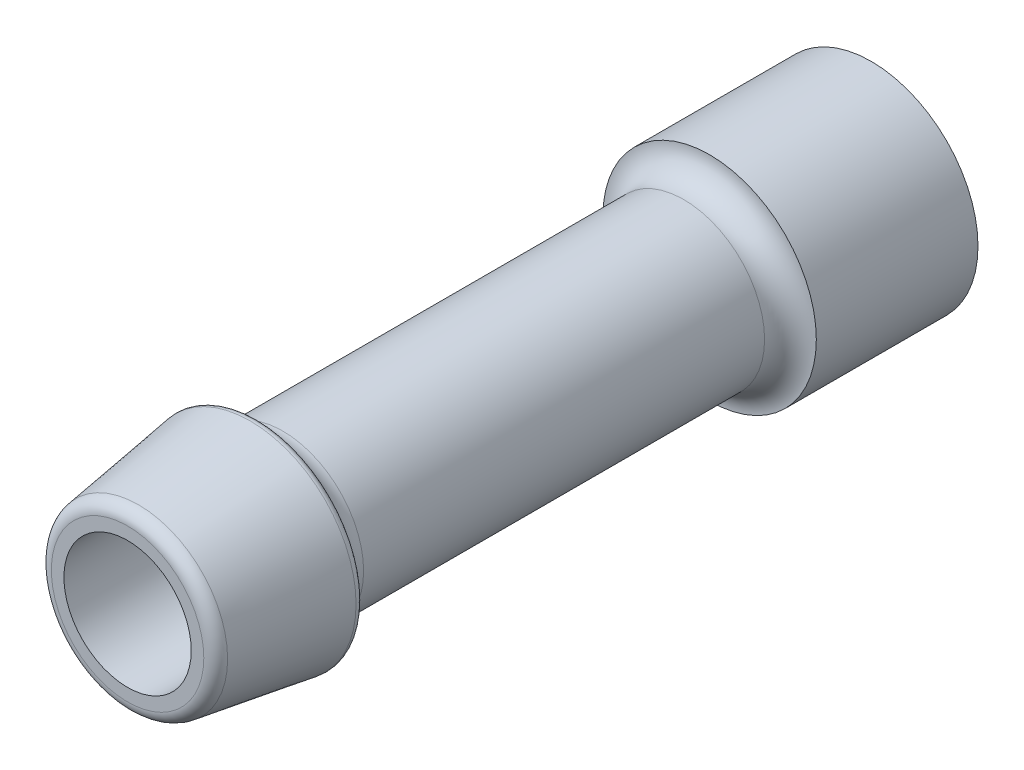
ISO-10303-21;
HEADER;
FILE_DESCRIPTION(('STEP AP214'),'2;1');
FILE_NAME('part.step','',(''),(''),'','','');
FILE_SCHEMA(('AUTOMOTIVE_DESIGN { 1 0 10303 214 1 1 1 1 }'));
ENDSEC;
DATA;
#1=APPLICATION_CONTEXT('core data for automotive mechanical design processes');
#2=APPLICATION_PROTOCOL_DEFINITION('international standard','automotive_design',2000,#1);
#3=PRODUCT_CONTEXT('',#1,'mechanical');
#4=PRODUCT('Part','Part','',(#3));
#5=PRODUCT_RELATED_PRODUCT_CATEGORY('part','',(#4));
#6=PRODUCT_DEFINITION_FORMATION('','',#4);
#7=PRODUCT_DEFINITION_CONTEXT('part definition',#1,'design');
#8=PRODUCT_DEFINITION('design','',#6,#7);
#9=PRODUCT_DEFINITION_SHAPE('','',#8);
#10=(LENGTH_UNIT() NAMED_UNIT(*) SI_UNIT(.MILLI.,.METRE.));
#11=(NAMED_UNIT(*) PLANE_ANGLE_UNIT() SI_UNIT($,.RADIAN.));
#12=(NAMED_UNIT(*) SI_UNIT($,.STERADIAN.) SOLID_ANGLE_UNIT());
#13=UNCERTAINTY_MEASURE_WITH_UNIT(LENGTH_MEASURE(1.E-05),#10,'distance_accuracy_value','');
#14=(GEOMETRIC_REPRESENTATION_CONTEXT(3) GLOBAL_UNCERTAINTY_ASSIGNED_CONTEXT((#13)) GLOBAL_UNIT_ASSIGNED_CONTEXT((#10,
#11,#12)) REPRESENTATION_CONTEXT('',''));
#15=CARTESIAN_POINT('',(0.,0.,0.));
#16=DIRECTION('',(0.,0.,1.));
#17=DIRECTION('',(1.,0.,0.));
#18=AXIS2_PLACEMENT_3D('',#15,#16,#17);
#19=CARTESIAN_POINT('',(0.,0.,29.21));
#20=DIRECTION('',(0.,0.,-1.));
#21=DIRECTION('',(-1.,0.,0.));
#22=AXIS2_PLACEMENT_3D('',#19,#20,#21);
#23=CYLINDRICAL_SURFACE('',#22,4.191);
#24=CARTESIAN_POINT('',(0.,0.,0.));
#25=DIRECTION('',(0.,0.,1.));
#26=DIRECTION('',(1.,0.,0.));
#27=AXIS2_PLACEMENT_3D('',#24,#25,#26);
#28=CIRCLE('',#27,4.191);
#29=CARTESIAN_POINT('',(-4.191,0.,0.));
#30=VERTEX_POINT('',#29);
#31=EDGE_CURVE('E71',#30,#30,#28,.T.);
#32=CARTESIAN_POINT('',(0.,0.,6.35));
#33=DIRECTION('',(0.,0.,1.));
#34=DIRECTION('',(1.,0.,0.));
#35=AXIS2_PLACEMENT_3D('',#32,#33,#34);
#36=CIRCLE('',#35,4.191);
#37=CARTESIAN_POINT('',(-4.191,0.,6.34999999999999));
#38=VERTEX_POINT('',#37);
#39=EDGE_CURVE('E72',#38,#38,#36,.T.);
#40=CARTESIAN_POINT('',(-4.191,0.,0.));
#41=CARTESIAN_POINT('',(-4.191,0.,0.066145833333333));
#42=CARTESIAN_POINT('',(-4.191,0.,0.132291666666666));
#43=CARTESIAN_POINT('',(-4.191,0.,0.264583333333332));
#44=CARTESIAN_POINT('',(-4.191,0.,0.330729166666665));
#45=CARTESIAN_POINT('',(-4.191,0.,0.463020833333332));
#46=CARTESIAN_POINT('',(-4.191,0.,0.529166666666666));
#47=CARTESIAN_POINT('',(-4.191,0.,0.661458333333333));
#48=CARTESIAN_POINT('',(-4.191,0.,0.727604166666666));
#49=CARTESIAN_POINT('',(-4.191,0.,0.859895833333332));
#50=CARTESIAN_POINT('',(-4.191,0.,0.926041666666665));
#51=CARTESIAN_POINT('',(-4.191,0.,1.05833333333333));
#52=CARTESIAN_POINT('',(-4.191,0.,1.12447916666667));
#53=CARTESIAN_POINT('',(-4.191,0.,1.25677083333333));
#54=CARTESIAN_POINT('',(-4.191,0.,1.32291666666667));
#55=CARTESIAN_POINT('',(-4.191,0.,1.45520833333333));
#56=CARTESIAN_POINT('',(-4.191,0.,1.52135416666667));
#57=CARTESIAN_POINT('',(-4.191,0.,1.65364583333333));
#58=CARTESIAN_POINT('',(-4.191,0.,1.71979166666666));
#59=CARTESIAN_POINT('',(-4.191,0.,1.85208333333333));
#60=CARTESIAN_POINT('',(-4.191,0.,1.91822916666666));
#61=CARTESIAN_POINT('',(-4.191,0.,2.05052083333333));
#62=CARTESIAN_POINT('',(-4.191,0.,2.11666666666666));
#63=CARTESIAN_POINT('',(-4.191,0.,2.24895833333333));
#64=CARTESIAN_POINT('',(-4.191,0.,2.31510416666667));
#65=CARTESIAN_POINT('',(-4.191,0.,2.44739583333333));
#66=CARTESIAN_POINT('',(-4.191,0.,2.51354166666666));
#67=CARTESIAN_POINT('',(-4.191,0.,2.64583333333333));
#68=CARTESIAN_POINT('',(-4.191,0.,2.71197916666667));
#69=CARTESIAN_POINT('',(-4.191,0.,2.84427083333333));
#70=CARTESIAN_POINT('',(-4.191,0.,2.91041666666667));
#71=CARTESIAN_POINT('',(-4.191,0.,3.04270833333333));
#72=CARTESIAN_POINT('',(-4.191,0.,3.10885416666666));
#73=CARTESIAN_POINT('',(-4.191,0.,3.24114583333333));
#74=CARTESIAN_POINT('',(-4.191,0.,3.30729166666666));
#75=CARTESIAN_POINT('',(-4.191,0.,3.43958333333333));
#76=CARTESIAN_POINT('',(-4.191,0.,3.50572916666666));
#77=CARTESIAN_POINT('',(-4.191,0.,3.63802083333333));
#78=CARTESIAN_POINT('',(-4.191,0.,3.70416666666666));
#79=CARTESIAN_POINT('',(-4.191,0.,3.83645833333333));
#80=CARTESIAN_POINT('',(-4.191,0.,3.90260416666666));
#81=CARTESIAN_POINT('',(-4.191,0.,4.03489583333333));
#82=CARTESIAN_POINT('',(-4.191,0.,4.10104166666666));
#83=CARTESIAN_POINT('',(-4.191,0.,4.23333333333333));
#84=CARTESIAN_POINT('',(-4.191,0.,4.29947916666666));
#85=CARTESIAN_POINT('',(-4.191,0.,4.43177083333333));
#86=CARTESIAN_POINT('',(-4.191,0.,4.49791666666666));
#87=CARTESIAN_POINT('',(-4.191,0.,4.63020833333333));
#88=CARTESIAN_POINT('',(-4.191,0.,4.69635416666666));
#89=CARTESIAN_POINT('',(-4.191,0.,4.82864583333333));
#90=CARTESIAN_POINT('',(-4.191,0.,4.89479166666666));
#91=CARTESIAN_POINT('',(-4.191,0.,5.02708333333333));
#92=CARTESIAN_POINT('',(-4.191,0.,5.09322916666666));
#93=CARTESIAN_POINT('',(-4.191,0.,5.22552083333333));
#94=CARTESIAN_POINT('',(-4.191,0.,5.29166666666666));
#95=CARTESIAN_POINT('',(-4.191,0.,5.42395833333333));
#96=CARTESIAN_POINT('',(-4.191,0.,5.49010416666666));
#97=CARTESIAN_POINT('',(-4.191,0.,5.62239583333333));
#98=CARTESIAN_POINT('',(-4.191,0.,5.68854166666666));
#99=CARTESIAN_POINT('',(-4.191,0.,5.82083333333333));
#100=CARTESIAN_POINT('',(-4.191,0.,5.88697916666666));
#101=CARTESIAN_POINT('',(-4.191,0.,6.01927083333333));
#102=CARTESIAN_POINT('',(-4.191,0.,6.08541666666666));
#103=CARTESIAN_POINT('',(-4.191,0.,6.21770833333333));
#104=CARTESIAN_POINT('',(-4.191,0.,6.28385416666666));
#105=CARTESIAN_POINT('',(-4.191,0.,6.34999999999999));
#106=B_SPLINE_CURVE_WITH_KNOTS('',3,(#40,#41,#42,#43,#44,#45,#46,#47,#48,#49,#50,#51,#52,#53,
#54,#55,#56,#57,#58,#59,#60,#61,#62,#63,#64,#65,#66,#67,#68,#69,#70,#71,#72,#73,#74,#75,#76,#77,
#78,#79,#80,#81,#82,#83,#84,#85,#86,#87,#88,#89,#90,#91,#92,#93,#94,#95,#96,#97,#98,#99,#100,
#101,#102,#103,#104,#105),.UNSPECIFIED.,.F.,.F.,(4,2,2,2,2,2,2,2,2,2,2,2,2,2,2,2,2,2,2,2,2,2,2,
2,2,2,2,2,2,2,2,2,4),(0.,0.198437499999999,0.396874999999998,0.5953125,0.793749999999999,
0.992187499999998,1.190625,1.3890625,1.5875,1.7859375,1.984375,2.1828125,2.38125,2.5796875,
2.778125,2.9765625,3.175,3.3734375,3.571875,3.7703125,3.96875,4.1671875,4.365625,4.5640625,
4.7625,4.96093749999999,5.15937499999999,5.3578125,5.55625,5.75468749999999,5.953125,6.1515625,
6.34999999999999),.UNSPECIFIED.);
#107=EDGE_CURVE('BSEAM39',#30,#38,#106,.T.);
#108=ORIENTED_EDGE('',*,*,#31,.T.);
#109=ORIENTED_EDGE('',*,*,#39,.F.);
#110=ORIENTED_EDGE('',*,*,#107,.T.);
#111=ORIENTED_EDGE('',*,*,#107,.F.);
#112=EDGE_LOOP('',(#108,#110,#109,#111));
#113=FACE_BOUND('',#112,.T.);
#114=ADVANCED_FACE('F39',(#113),#23,.T.);
#115=CARTESIAN_POINT('',(0.,0.,29.21));
#116=DIRECTION('',(0.,0.,1.));
#117=DIRECTION('',(1.,0.,0.));
#118=AXIS2_PLACEMENT_3D('',#115,#116,#117);
#119=PLANE('',#118);
#120=CARTESIAN_POINT('',(0.,0.,29.21));
#121=DIRECTION('',(0.,0.,1.));
#122=DIRECTION('',(1.,0.,0.));
#123=AXIS2_PLACEMENT_3D('',#120,#121,#122);
#124=CIRCLE('',#123,2.99406810887688);
#125=CARTESIAN_POINT('',(2.99406810887688,0.,29.21));
#126=VERTEX_POINT('',#125);
#127=EDGE_CURVE('E47',#126,#126,#124,.T.);
#128=ORIENTED_EDGE('',*,*,#127,.T.);
#129=EDGE_LOOP('',(#128));
#130=FACE_BOUND('',#129,.T.);
#131=CARTESIAN_POINT('',(0.,0.,29.21));
#132=DIRECTION('',(0.,0.,1.));
#133=DIRECTION('',(1.,0.,0.));
#134=AXIS2_PLACEMENT_3D('',#131,#132,#133);
#135=CIRCLE('',#134,2.5);
#136=CARTESIAN_POINT('',(2.5,0.,29.21));
#137=VERTEX_POINT('',#136);
#138=EDGE_CURVE('E76',#137,#137,#135,.T.);
#139=ORIENTED_EDGE('',*,*,#138,.F.);
#140=EDGE_LOOP('',(#139));
#141=FACE_BOUND('',#140,.T.);
#142=ADVANCED_FACE('F90',(#130,#141),#119,.T.);
#143=CARTESIAN_POINT('',(0.,0.,0.));
#144=DIRECTION('',(0.,0.,1.));
#145=DIRECTION('',(1.,0.,0.));
#146=AXIS2_PLACEMENT_3D('',#143,#144,#145);
#147=PLANE('',#146);
#148=CARTESIAN_POINT('',(0.,0.,0.));
#149=DIRECTION('',(0.,0.,1.));
#150=DIRECTION('',(1.,0.,0.));
#151=AXIS2_PLACEMENT_3D('',#148,#149,#150);
#152=CIRCLE('',#151,2.5);
#153=CARTESIAN_POINT('',(2.5,0.,0.));
#154=VERTEX_POINT('',#153);
#155=EDGE_CURVE('E80',#154,#154,#152,.T.);
#156=ORIENTED_EDGE('',*,*,#155,.T.);
#157=EDGE_LOOP('',(#156));
#158=FACE_BOUND('',#157,.T.);
#159=ORIENTED_EDGE('',*,*,#31,.F.);
#160=EDGE_LOOP('',(#159));
#161=FACE_BOUND('',#160,.T.);
#162=ADVANCED_FACE('F92',(#158,#161),#147,.F.);
#163=CARTESIAN_POINT('',(0.,0.,30.21));
#164=DIRECTION('',(0.,0.,-1.));
#165=DIRECTION('',(-1.,0.,0.));
#166=AXIS2_PLACEMENT_3D('',#163,#164,#165);
#167=CYLINDRICAL_SURFACE('',#166,2.5);
#168=ORIENTED_EDGE('',*,*,#155,.F.);
#169=EDGE_LOOP('',(#168));
#170=FACE_BOUND('',#169,.T.);
#171=ORIENTED_EDGE('',*,*,#138,.T.);
#172=EDGE_LOOP('',(#171));
#173=FACE_BOUND('',#172,.T.);
#174=ADVANCED_FACE('F88',(#170,#173),#167,.F.);
#175=CARTESIAN_POINT('',(0.,0.,6.35));
#176=DIRECTION('',(0.,0.,1.));
#177=DIRECTION('',(1.,0.,0.));
#178=AXIS2_PLACEMENT_3D('',#175,#176,#177);
#179=CYLINDRICAL_SURFACE('',#178,3.175);
#180=CARTESIAN_POINT('',(0.,0.,23.114));
#181=DIRECTION('',(0.,0.,1.));
#182=DIRECTION('',(1.,0.,0.));
#183=AXIS2_PLACEMENT_3D('',#180,#181,#182);
#184=CIRCLE('',#183,3.175);
#185=CARTESIAN_POINT('',(3.175,0.,23.114));
#186=VERTEX_POINT('',#185);
#187=EDGE_CURVE('E63',#186,#186,#184,.F.);
#188=ORIENTED_EDGE('',*,*,#187,.T.);
#189=EDGE_LOOP('',(#188));
#190=FACE_BOUND('',#189,.T.);
#191=CARTESIAN_POINT('',(0.,0.,7.366));
#192=DIRECTION('',(0.,0.,1.));
#193=DIRECTION('',(1.,0.,0.));
#194=AXIS2_PLACEMENT_3D('',#191,#192,#193);
#195=CIRCLE('',#194,3.175);
#196=CARTESIAN_POINT('',(3.175,0.,7.366));
#197=VERTEX_POINT('',#196);
#198=EDGE_CURVE('E67',#197,#197,#195,.T.);
#199=ORIENTED_EDGE('',*,*,#198,.T.);
#200=EDGE_LOOP('',(#199));
#201=FACE_BOUND('',#200,.T.);
#202=ADVANCED_FACE('F109',(#190,#201),#179,.T.);
#203=CARTESIAN_POINT('',(0.,0.,7.366));
#204=DIRECTION('',(0.,0.,1.));
#205=DIRECTION('',(1.,0.,0.));
#206=AXIS2_PLACEMENT_3D('',#203,#204,#205);
#207=TOROIDAL_SURFACE('',#206,4.191,1.016);
#208=ORIENTED_EDGE('',*,*,#39,.T.);
#209=EDGE_LOOP('',(#208));
#210=FACE_BOUND('',#209,.T.);
#211=ORIENTED_EDGE('',*,*,#198,.F.);
#212=EDGE_LOOP('',(#211));
#213=FACE_BOUND('',#212,.T.);
#214=ADVANCED_FACE('F105',(#210,#213),#207,.F.);
#215=CARTESIAN_POINT('',(0.,0.,23.114));
#216=DIRECTION('',(0.,0.,1.));
#217=DIRECTION('',(1.,0.,0.));
#218=AXIS2_PLACEMENT_3D('',#215,#216,#217);
#219=TOROIDAL_SURFACE('',#218,4.191,1.016);
#220=CARTESIAN_POINT('',(0.,0.,24.1031994549213));
#221=DIRECTION('',(0.,0.,-1.));
#222=DIRECTION('',(-1.,0.,0.));
#223=AXIS2_PLACEMENT_3D('',#220,#221,#222);
#224=CIRCLE('',#223,3.95918015964262);
#225=CARTESIAN_POINT('',(-3.95918015964262,0.,24.1031994549213));
#226=VERTEX_POINT('',#225);
#227=EDGE_CURVE('E52',#226,#226,#224,.T.);
#228=ORIENTED_EDGE('',*,*,#227,.T.);
#229=EDGE_LOOP('',(#228));
#230=FACE_BOUND('',#229,.T.);
#231=ORIENTED_EDGE('',*,*,#187,.F.);
#232=EDGE_LOOP('',(#231));
#233=FACE_BOUND('',#232,.T.);
#234=ADVANCED_FACE('F108',(#230,#233),#219,.F.);
#235=CARTESIAN_POINT('',(0.,0.,29.21));
#236=DIRECTION('',(0.,0.,-1.));
#237=DIRECTION('',(-1.,0.,0.));
#238=AXIS2_PLACEMENT_3D('',#235,#236,#237);
#239=CONICAL_SURFACE('',#238,3.43178891314647,0.148352986419515);
#240=CARTESIAN_POINT('',(0.,0.,28.7770871808538));
#241=DIRECTION('',(0.,0.,1.));
#242=DIRECTION('',(1.,0.,0.));
#243=AXIS2_PLACEMENT_3D('',#240,#241,#242);
#244=CIRCLE('',#243,3.49648816746474);
#245=CARTESIAN_POINT('',(3.49648816746474,0.,28.7770871808538));
#246=VERTEX_POINT('',#245);
#247=EDGE_CURVE('E10',#246,#246,#244,.F.);
#248=ORIENTED_EDGE('',*,*,#247,.T.);
#249=EDGE_LOOP('',(#248));
#250=FACE_BOUND('',#249,.T.);
#251=CARTESIAN_POINT('',(0.,0.,24.3880429090786));
#252=DIRECTION('',(0.,0.,-1.));
#253=DIRECTION('',(-1.,0.,0.));
#254=AXIS2_PLACEMENT_3D('',#251,#252,#253);
#255=CIRCLE('',#254,4.15243522884719);
#256=CARTESIAN_POINT('',(-4.15243522884719,0.,24.3880429090786));
#257=VERTEX_POINT('',#256);
#258=EDGE_CURVE('E57',#257,#257,#255,.F.);
#259=ORIENTED_EDGE('',*,*,#258,.T.);
#260=EDGE_LOOP('',(#259));
#261=FACE_BOUND('',#260,.T.);
#262=ADVANCED_FACE('F113',(#250,#261),#239,.T.);
#263=CARTESIAN_POINT('',(0.,0.,24.3504993186517));
#264=DIRECTION('',(0.,0.,-1.));
#265=DIRECTION('',(-1.,0.,0.));
#266=AXIS2_PLACEMENT_3D('',#263,#264,#265);
#267=TOROIDAL_SURFACE('',#266,3.90122519955326,0.254);
#268=ORIENTED_EDGE('',*,*,#227,.F.);
#269=EDGE_LOOP('',(#268));
#270=FACE_BOUND('',#269,.T.);
#271=ORIENTED_EDGE('',*,*,#258,.F.);
#272=EDGE_LOOP('',(#271));
#273=FACE_BOUND('',#272,.T.);
#274=ADVANCED_FACE('F119',(#270,#273),#267,.T.);
#275=CARTESIAN_POINT('',(0.,0.,28.702));
#276=DIRECTION('',(0.,0.,1.));
#277=DIRECTION('',(1.,0.,0.));
#278=AXIS2_PLACEMENT_3D('',#275,#276,#277);
#279=TOROIDAL_SURFACE('',#278,2.99406810887688,0.508);
#280=ORIENTED_EDGE('',*,*,#247,.F.);
#281=EDGE_LOOP('',(#280));
#282=FACE_BOUND('',#281,.T.);
#283=ORIENTED_EDGE('',*,*,#127,.F.);
#284=EDGE_LOOP('',(#283));
#285=FACE_BOUND('',#284,.T.);
#286=ADVANCED_FACE('F41',(#282,#285),#279,.T.);
#287=CLOSED_SHELL('',(#114,#142,#162,#174,#202,#214,#234,#262,#274,#286));
#288=MANIFOLD_SOLID_BREP('B2',#287);
#289=ADVANCED_BREP_SHAPE_REPRESENTATION('',(#18,#288),#14);
#290=SHAPE_DEFINITION_REPRESENTATION(#9,#289);
ENDSEC;
END-ISO-10303-21;
